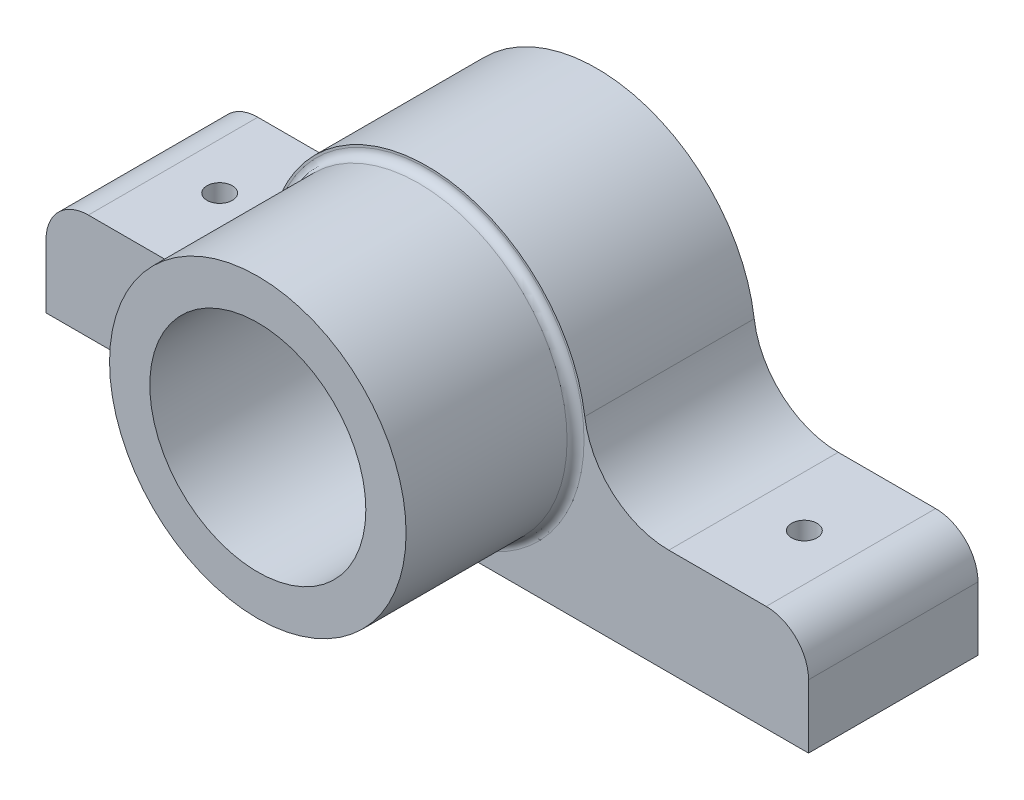
ISO-10303-21;
HEADER;
FILE_DESCRIPTION(('STEP AP214'),'2;1');
FILE_NAME('part.step','',(''),(''),'','','');
FILE_SCHEMA(('AUTOMOTIVE_DESIGN { 1 0 10303 214 1 1 1 1 }'));
ENDSEC;
DATA;
#1=APPLICATION_CONTEXT('core data for automotive mechanical design processes');
#2=APPLICATION_PROTOCOL_DEFINITION('international standard','automotive_design',2000,#1);
#3=PRODUCT_CONTEXT('',#1,'mechanical');
#4=PRODUCT('Part','Part','',(#3));
#5=PRODUCT_RELATED_PRODUCT_CATEGORY('part','',(#4));
#6=PRODUCT_DEFINITION_FORMATION('','',#4);
#7=PRODUCT_DEFINITION_CONTEXT('part definition',#1,'design');
#8=PRODUCT_DEFINITION('design','',#6,#7);
#9=PRODUCT_DEFINITION_SHAPE('','',#8);
#10=(LENGTH_UNIT() NAMED_UNIT(*) SI_UNIT(.MILLI.,.METRE.));
#11=(NAMED_UNIT(*) PLANE_ANGLE_UNIT() SI_UNIT($,.RADIAN.));
#12=(NAMED_UNIT(*) SI_UNIT($,.STERADIAN.) SOLID_ANGLE_UNIT());
#13=UNCERTAINTY_MEASURE_WITH_UNIT(LENGTH_MEASURE(1.E-05),#10,'distance_accuracy_value','');
#14=(GEOMETRIC_REPRESENTATION_CONTEXT(3) GLOBAL_UNCERTAINTY_ASSIGNED_CONTEXT((#13)) GLOBAL_UNIT_ASSIGNED_CONTEXT((#10,
#11,#12)) REPRESENTATION_CONTEXT('',''));
#15=CARTESIAN_POINT('',(0.,0.,0.));
#16=DIRECTION('',(0.,0.,1.));
#17=DIRECTION('',(1.,0.,0.));
#18=AXIS2_PLACEMENT_3D('',#15,#16,#17);
#19=CARTESIAN_POINT('',(6.35,4.7625,5.08));
#20=DIRECTION('',(0.,0.,-1.));
#21=DIRECTION('',(-1.,0.,0.));
#22=AXIS2_PLACEMENT_3D('',#19,#20,#21);
#23=CYLINDRICAL_SURFACE('',#22,0.635000000000001);
#24=CARTESIAN_POINT('',(6.35,4.7625,0.));
#25=DIRECTION('',(0.,0.,1.));
#26=DIRECTION('',(1.,0.,0.));
#27=AXIS2_PLACEMENT_3D('',#24,#25,#26);
#28=CIRCLE('',#27,0.635000000000001);
#29=CARTESIAN_POINT('',(6.985,4.7625,0.));
#30=VERTEX_POINT('',#29);
#31=EDGE_CURVE('E125',#30,#30,#28,.T.);
#32=ORIENTED_EDGE('',*,*,#31,.F.);
#33=EDGE_LOOP('',(#32));
#34=FACE_BOUND('',#33,.T.);
#35=CARTESIAN_POINT('',(6.35,4.7625,3.81));
#36=DIRECTION('',(0.,0.,1.));
#37=DIRECTION('',(1.,0.,0.));
#38=AXIS2_PLACEMENT_3D('',#35,#36,#37);
#39=CIRCLE('',#38,0.635000000000001);
#40=CARTESIAN_POINT('',(6.985,4.7625,3.81));
#41=VERTEX_POINT('',#40);
#42=EDGE_CURVE('E146',#41,#41,#39,.T.);
#43=ORIENTED_EDGE('',*,*,#42,.T.);
#44=EDGE_LOOP('',(#43));
#45=FACE_BOUND('',#44,.T.);
#46=ADVANCED_FACE('F32',(#34,#45),#23,.F.);
#47=CARTESIAN_POINT('',(70.29958,4.7625,5.08));
#48=DIRECTION('',(0.,0.,1.));
#49=DIRECTION('',(1.,0.,0.));
#50=AXIS2_PLACEMENT_3D('',#47,#48,#49);
#51=PLANE('',#50);
#52=DIRECTION('',(0.,-1.,0.));
#53=VECTOR('',#52,1.);
#54=CARTESIAN_POINT('',(17.78,4.76250000000001,5.08));
#55=LINE('',#54,#53);
#56=CARTESIAN_POINT('',(17.78,1.905,5.08));
#57=VERTEX_POINT('',#56);
#58=CARTESIAN_POINT('',(17.78,0.,5.08));
#59=VERTEX_POINT('',#58);
#60=EDGE_CURVE('E109',#57,#59,#55,.T.);
#61=ORIENTED_EDGE('',*,*,#60,.F.);
#62=CARTESIAN_POINT('',(16.51,1.905,5.08));
#63=DIRECTION('',(0.,0.,1.));
#64=DIRECTION('',(1.,0.,0.));
#65=AXIS2_PLACEMENT_3D('',#62,#63,#64);
#66=CIRCLE('',#65,1.27);
#67=CARTESIAN_POINT('',(16.51,3.175,5.08));
#68=VERTEX_POINT('',#67);
#69=EDGE_CURVE('E11',#57,#68,#66,.T.);
#70=ORIENTED_EDGE('',*,*,#69,.T.);
#71=DIRECTION('',(-1.,0.,0.));
#72=VECTOR('',#71,1.);
#73=CARTESIAN_POINT('',(11.1125,3.175,5.08));
#74=LINE('',#73,#72);
#75=CARTESIAN_POINT('',(13.5901139493795,3.175,5.08));
#76=VERTEX_POINT('',#75);
#77=EDGE_CURVE('E191',#68,#76,#74,.T.);
#78=ORIENTED_EDGE('',*,*,#77,.T.);
#79=CARTESIAN_POINT('',(13.5901139493795,5.715,5.08));
#80=DIRECTION('',(0.,0.,1.));
#81=DIRECTION('',(1.,0.,0.));
#82=AXIS2_PLACEMENT_3D('',#79,#80,#81);
#83=CIRCLE('',#82,2.54);
#84=CARTESIAN_POINT('',(11.0718134452475,5.38369565217391,5.08));
#85=VERTEX_POINT('',#84);
#86=EDGE_CURVE('E169',#76,#85,#83,.F.);
#87=ORIENTED_EDGE('',*,*,#86,.T.);
#88=CARTESIAN_POINT('',(6.35,4.7625,5.08));
#89=DIRECTION('',(0.,0.,1.));
#90=DIRECTION('',(-1.,0.,0.));
#91=AXIS2_PLACEMENT_3D('',#88,#89,#90);
#92=CIRCLE('',#91,4.7625);
#93=CARTESIAN_POINT('',(1.62818655475248,5.38369565217391,5.08));
#94=VERTEX_POINT('',#93);
#95=EDGE_CURVE('E205',#85,#94,#92,.T.);
#96=ORIENTED_EDGE('',*,*,#95,.T.);
#97=CARTESIAN_POINT('',(-0.890113949379528,5.715,5.08));
#98=DIRECTION('',(0.,0.,1.));
#99=DIRECTION('',(1.,0.,0.));
#100=AXIS2_PLACEMENT_3D('',#97,#98,#99);
#101=CIRCLE('',#100,2.54);
#102=CARTESIAN_POINT('',(-0.890113949379527,3.175,5.08));
#103=VERTEX_POINT('',#102);
#104=EDGE_CURVE('E173',#94,#103,#101,.F.);
#105=ORIENTED_EDGE('',*,*,#104,.T.);
#106=DIRECTION('',(-1.,0.,0.));
#107=VECTOR('',#106,1.);
#108=CARTESIAN_POINT('',(0.,3.175,5.08));
#109=LINE('',#108,#107);
#110=CARTESIAN_POINT('',(-3.81,3.175,5.08));
#111=VERTEX_POINT('',#110);
#112=EDGE_CURVE('E210',#103,#111,#109,.T.);
#113=ORIENTED_EDGE('',*,*,#112,.T.);
#114=CARTESIAN_POINT('',(-3.81,1.905,5.08));
#115=DIRECTION('',(0.,0.,1.));
#116=DIRECTION('',(1.,0.,0.));
#117=AXIS2_PLACEMENT_3D('',#114,#115,#116);
#118=CIRCLE('',#117,1.27);
#119=CARTESIAN_POINT('',(-5.08,1.905,5.08));
#120=VERTEX_POINT('',#119);
#121=EDGE_CURVE('E177',#111,#120,#118,.T.);
#122=ORIENTED_EDGE('',*,*,#121,.T.);
#123=DIRECTION('',(0.,-1.,0.));
#124=VECTOR('',#123,1.);
#125=CARTESIAN_POINT('',(-5.08,3.175,5.08));
#126=LINE('',#125,#124);
#127=CARTESIAN_POINT('',(-5.08,0.,5.08));
#128=VERTEX_POINT('',#127);
#129=EDGE_CURVE('E133',#120,#128,#126,.T.);
#130=ORIENTED_EDGE('',*,*,#129,.T.);
#131=DIRECTION('',(1.,0.,0.));
#132=VECTOR('',#131,1.);
#133=CARTESIAN_POINT('',(-5.08,0.,5.08));
#134=LINE('',#133,#132);
#135=EDGE_CURVE('E143',#128,#59,#134,.T.);
#136=ORIENTED_EDGE('',*,*,#135,.T.);
#137=EDGE_LOOP('',(#61,#70,#78,#87,#96,#105,#113,#122,#130,#136));
#138=FACE_BOUND('',#137,.T.);
#139=CARTESIAN_POINT('',(6.35,4.7625,5.08));
#140=DIRECTION('',(0.,0.,1.));
#141=DIRECTION('',(1.,0.,0.));
#142=AXIS2_PLACEMENT_3D('',#139,#140,#141);
#143=CIRCLE('',#142,4.699);
#144=CARTESIAN_POINT('',(11.049,4.7625,5.08));
#145=VERTEX_POINT('',#144);
#146=EDGE_CURVE('E145',#145,#145,#143,.F.);
#147=ORIENTED_EDGE('',*,*,#146,.T.);
#148=EDGE_LOOP('',(#147));
#149=FACE_BOUND('',#148,.T.);
#150=ADVANCED_FACE('F203',(#138,#149),#51,.T.);
#151=CARTESIAN_POINT('',(70.29958,4.7625,0.));
#152=DIRECTION('',(0.,0.,1.));
#153=DIRECTION('',(1.,0.,0.));
#154=AXIS2_PLACEMENT_3D('',#151,#152,#153);
#155=PLANE('',#154);
#156=ORIENTED_EDGE('',*,*,#31,.T.);
#157=EDGE_LOOP('',(#156));
#158=FACE_BOUND('',#157,.T.);
#159=DIRECTION('',(-1.,0.,0.));
#160=VECTOR('',#159,1.);
#161=CARTESIAN_POINT('',(11.1125,3.175,0.));
#162=LINE('',#161,#160);
#163=CARTESIAN_POINT('',(16.51,3.175,0.));
#164=VERTEX_POINT('',#163);
#165=CARTESIAN_POINT('',(13.5901139493795,3.175,0.));
#166=VERTEX_POINT('',#165);
#167=EDGE_CURVE('E124',#164,#166,#162,.T.);
#168=ORIENTED_EDGE('',*,*,#167,.F.);
#169=CARTESIAN_POINT('',(16.51,1.905,0.));
#170=DIRECTION('',(0.,0.,1.));
#171=DIRECTION('',(1.,0.,0.));
#172=AXIS2_PLACEMENT_3D('',#169,#170,#171);
#173=CIRCLE('',#172,1.27);
#174=CARTESIAN_POINT('',(17.78,1.905,0.));
#175=VERTEX_POINT('',#174);
#176=EDGE_CURVE('E54',#164,#175,#173,.F.);
#177=ORIENTED_EDGE('',*,*,#176,.T.);
#178=DIRECTION('',(0.,1.,0.));
#179=VECTOR('',#178,1.);
#180=CARTESIAN_POINT('',(17.78,0.,0.));
#181=LINE('',#180,#179);
#182=CARTESIAN_POINT('',(17.78,0.,0.));
#183=VERTEX_POINT('',#182);
#184=EDGE_CURVE('E108',#183,#175,#181,.T.);
#185=ORIENTED_EDGE('',*,*,#184,.F.);
#186=DIRECTION('',(1.,0.,0.));
#187=VECTOR('',#186,1.);
#188=CARTESIAN_POINT('',(81.72958,0.,0.));
#189=LINE('',#188,#187);
#190=CARTESIAN_POINT('',(-5.08,0.,0.));
#191=VERTEX_POINT('',#190);
#192=EDGE_CURVE('E118',#191,#183,#189,.T.);
#193=ORIENTED_EDGE('',*,*,#192,.F.);
#194=DIRECTION('',(0.,-1.,0.));
#195=VECTOR('',#194,1.);
#196=CARTESIAN_POINT('',(-5.08,3.175,0.));
#197=LINE('',#196,#195);
#198=CARTESIAN_POINT('',(-5.08,1.905,0.));
#199=VERTEX_POINT('',#198);
#200=EDGE_CURVE('E141',#199,#191,#197,.T.);
#201=ORIENTED_EDGE('',*,*,#200,.F.);
#202=CARTESIAN_POINT('',(-3.81,1.905,0.));
#203=DIRECTION('',(0.,0.,1.));
#204=DIRECTION('',(1.,0.,0.));
#205=AXIS2_PLACEMENT_3D('',#202,#203,#204);
#206=CIRCLE('',#205,1.27);
#207=CARTESIAN_POINT('',(-3.81,3.175,0.));
#208=VERTEX_POINT('',#207);
#209=EDGE_CURVE('E175',#199,#208,#206,.F.);
#210=ORIENTED_EDGE('',*,*,#209,.T.);
#211=DIRECTION('',(-1.,0.,0.));
#212=VECTOR('',#211,1.);
#213=CARTESIAN_POINT('',(0.,3.175,0.));
#214=LINE('',#213,#212);
#215=CARTESIAN_POINT('',(-0.890113949379527,3.175,0.));
#216=VERTEX_POINT('',#215);
#217=EDGE_CURVE('E138',#216,#208,#214,.T.);
#218=ORIENTED_EDGE('',*,*,#217,.F.);
#219=CARTESIAN_POINT('',(-0.890113949379528,5.715,0.));
#220=DIRECTION('',(0.,0.,1.));
#221=DIRECTION('',(1.,0.,0.));
#222=AXIS2_PLACEMENT_3D('',#219,#220,#221);
#223=CIRCLE('',#222,2.54);
#224=CARTESIAN_POINT('',(1.62818655475248,5.38369565217391,0.));
#225=VERTEX_POINT('',#224);
#226=EDGE_CURVE('E171',#216,#225,#223,.T.);
#227=ORIENTED_EDGE('',*,*,#226,.T.);
#228=CARTESIAN_POINT('',(6.35,4.7625,0.));
#229=DIRECTION('',(0.,0.,1.));
#230=DIRECTION('',(-1.,0.,0.));
#231=AXIS2_PLACEMENT_3D('',#228,#229,#230);
#232=CIRCLE('',#231,4.7625);
#233=CARTESIAN_POINT('',(11.0718134452475,5.38369565217391,0.));
#234=VERTEX_POINT('',#233);
#235=EDGE_CURVE('E127',#234,#225,#232,.T.);
#236=ORIENTED_EDGE('',*,*,#235,.F.);
#237=CARTESIAN_POINT('',(13.5901139493795,5.715,0.));
#238=DIRECTION('',(0.,0.,1.));
#239=DIRECTION('',(1.,0.,0.));
#240=AXIS2_PLACEMENT_3D('',#237,#238,#239);
#241=CIRCLE('',#240,2.54);
#242=EDGE_CURVE('E166',#234,#166,#241,.T.);
#243=ORIENTED_EDGE('',*,*,#242,.T.);
#244=EDGE_LOOP('',(#168,#177,#185,#193,#201,#210,#218,#227,#236,#243));
#245=FACE_BOUND('',#244,.T.);
#246=ADVANCED_FACE('F116',(#158,#245),#155,.F.);
#247=CARTESIAN_POINT('',(81.72958,0.,5.08));
#248=DIRECTION('',(0.,1.,0.));
#249=DIRECTION('',(-1.,0.,0.));
#250=AXIS2_PLACEMENT_3D('',#247,#248,#249);
#251=PLANE('',#250);
#252=CARTESIAN_POINT('',(15.113,0.,2.54));
#253=DIRECTION('',(0.,1.,0.));
#254=DIRECTION('',(-1.,0.,0.));
#255=AXIS2_PLACEMENT_3D('',#252,#253,#254);
#256=CIRCLE('',#255,0.381);
#257=CARTESIAN_POINT('',(14.732,0.,2.54));
#258=VERTEX_POINT('',#257);
#259=EDGE_CURVE('E227',#258,#258,#256,.T.);
#260=ORIENTED_EDGE('',*,*,#259,.T.);
#261=EDGE_LOOP('',(#260));
#262=FACE_BOUND('',#261,.T.);
#263=CARTESIAN_POINT('',(-2.413,0.,2.54));
#264=DIRECTION('',(0.,1.,0.));
#265=DIRECTION('',(-1.,0.,0.));
#266=AXIS2_PLACEMENT_3D('',#263,#264,#265);
#267=CIRCLE('',#266,0.381);
#268=CARTESIAN_POINT('',(-2.794,0.,2.54));
#269=VERTEX_POINT('',#268);
#270=EDGE_CURVE('E221',#269,#269,#267,.T.);
#271=ORIENTED_EDGE('',*,*,#270,.T.);
#272=EDGE_LOOP('',(#271));
#273=FACE_BOUND('',#272,.T.);
#274=ORIENTED_EDGE('',*,*,#192,.T.);
#275=DIRECTION('',(0.,0.,1.));
#276=VECTOR('',#275,1.);
#277=CARTESIAN_POINT('',(17.78,0.,0.));
#278=LINE('',#277,#276);
#279=EDGE_CURVE('E106',#183,#59,#278,.T.);
#280=ORIENTED_EDGE('',*,*,#279,.T.);
#281=ORIENTED_EDGE('',*,*,#135,.F.);
#282=DIRECTION('',(0.,0.,-1.));
#283=VECTOR('',#282,1.);
#284=CARTESIAN_POINT('',(-5.08,0.,5.08));
#285=LINE('',#284,#283);
#286=EDGE_CURVE('E123',#128,#191,#285,.T.);
#287=ORIENTED_EDGE('',*,*,#286,.T.);
#288=EDGE_LOOP('',(#274,#280,#281,#287));
#289=FACE_BOUND('',#288,.T.);
#290=ADVANCED_FACE('F121',(#262,#273,#289),#251,.F.);
#291=CARTESIAN_POINT('',(11.1125,3.175,5.08));
#292=DIRECTION('',(0.,-1.,0.));
#293=DIRECTION('',(1.,0.,0.));
#294=AXIS2_PLACEMENT_3D('',#291,#292,#293);
#295=PLANE('',#294);
#296=CARTESIAN_POINT('',(15.113,3.175,2.54));
#297=DIRECTION('',(0.,1.,0.));
#298=DIRECTION('',(-1.,0.,0.));
#299=AXIS2_PLACEMENT_3D('',#296,#297,#298);
#300=CIRCLE('',#299,0.381);
#301=CARTESIAN_POINT('',(14.732,3.175,2.54));
#302=VERTEX_POINT('',#301);
#303=EDGE_CURVE('E230',#302,#302,#300,.T.);
#304=ORIENTED_EDGE('',*,*,#303,.F.);
#305=EDGE_LOOP('',(#304));
#306=FACE_BOUND('',#305,.T.);
#307=ORIENTED_EDGE('',*,*,#77,.F.);
#308=DIRECTION('',(0.,0.,-1.));
#309=VECTOR('',#308,1.);
#310=CARTESIAN_POINT('',(16.51,3.175,5.08));
#311=LINE('',#310,#309);
#312=EDGE_CURVE('E184',#68,#164,#311,.T.);
#313=ORIENTED_EDGE('',*,*,#312,.T.);
#314=ORIENTED_EDGE('',*,*,#167,.T.);
#315=DIRECTION('',(0.,0.,1.));
#316=VECTOR('',#315,1.);
#317=CARTESIAN_POINT('',(13.5901139493795,3.175,5.08));
#318=LINE('',#317,#316);
#319=EDGE_CURVE('E160',#166,#76,#318,.T.);
#320=ORIENTED_EDGE('',*,*,#319,.T.);
#321=EDGE_LOOP('',(#307,#313,#314,#320));
#322=FACE_BOUND('',#321,.T.);
#323=ADVANCED_FACE('F190',(#306,#322),#295,.F.);
#324=CARTESIAN_POINT('',(6.35,4.7625,5.08));
#325=DIRECTION('',(0.,0.,-1.));
#326=DIRECTION('',(-1.,0.,0.));
#327=AXIS2_PLACEMENT_3D('',#324,#325,#326);
#328=CYLINDRICAL_SURFACE('',#327,4.7625);
#329=ORIENTED_EDGE('',*,*,#95,.F.);
#330=DIRECTION('',(0.,0.,-1.));
#331=VECTOR('',#330,1.);
#332=CARTESIAN_POINT('',(11.0718134452475,5.38369565217391,5.08));
#333=LINE('',#332,#331);
#334=EDGE_CURVE('E157',#85,#234,#333,.T.);
#335=ORIENTED_EDGE('',*,*,#334,.T.);
#336=ORIENTED_EDGE('',*,*,#235,.T.);
#337=DIRECTION('',(0.,0.,-1.));
#338=VECTOR('',#337,1.);
#339=CARTESIAN_POINT('',(1.62818655475248,5.38369565217391,5.08));
#340=LINE('',#339,#338);
#341=EDGE_CURVE('E155',#225,#94,#340,.F.);
#342=ORIENTED_EDGE('',*,*,#341,.T.);
#343=EDGE_LOOP('',(#329,#335,#336,#342));
#344=FACE_BOUND('',#343,.T.);
#345=ADVANCED_FACE('F208',(#344),#328,.T.);
#346=CARTESIAN_POINT('',(0.,3.175,5.08));
#347=DIRECTION('',(0.,-1.,0.));
#348=DIRECTION('',(1.,0.,0.));
#349=AXIS2_PLACEMENT_3D('',#346,#347,#348);
#350=PLANE('',#349);
#351=CARTESIAN_POINT('',(-2.413,3.175,2.54));
#352=DIRECTION('',(0.,1.,0.));
#353=DIRECTION('',(-1.,0.,0.));
#354=AXIS2_PLACEMENT_3D('',#351,#352,#353);
#355=CIRCLE('',#354,0.381);
#356=CARTESIAN_POINT('',(-2.794,3.175,2.54));
#357=VERTEX_POINT('',#356);
#358=EDGE_CURVE('E224',#357,#357,#355,.T.);
#359=ORIENTED_EDGE('',*,*,#358,.F.);
#360=EDGE_LOOP('',(#359));
#361=FACE_BOUND('',#360,.T.);
#362=ORIENTED_EDGE('',*,*,#217,.T.);
#363=DIRECTION('',(0.,0.,-1.));
#364=VECTOR('',#363,1.);
#365=CARTESIAN_POINT('',(-3.81,3.175,5.08));
#366=LINE('',#365,#364);
#367=EDGE_CURVE('E182',#208,#111,#366,.F.);
#368=ORIENTED_EDGE('',*,*,#367,.T.);
#369=ORIENTED_EDGE('',*,*,#112,.F.);
#370=DIRECTION('',(0.,0.,1.));
#371=VECTOR('',#370,1.);
#372=CARTESIAN_POINT('',(-0.890113949379527,3.175,0.));
#373=LINE('',#372,#371);
#374=EDGE_CURVE('E163',#103,#216,#373,.F.);
#375=ORIENTED_EDGE('',*,*,#374,.T.);
#376=EDGE_LOOP('',(#362,#368,#369,#375));
#377=FACE_BOUND('',#376,.T.);
#378=ADVANCED_FACE('F252',(#361,#377),#350,.F.);
#379=CARTESIAN_POINT('',(-5.08,3.175,5.08));
#380=DIRECTION('',(1.,0.,0.));
#381=DIRECTION('',(0.,1.,0.));
#382=AXIS2_PLACEMENT_3D('',#379,#380,#381);
#383=PLANE('',#382);
#384=ORIENTED_EDGE('',*,*,#129,.F.);
#385=DIRECTION('',(0.,0.,-1.));
#386=VECTOR('',#385,1.);
#387=CARTESIAN_POINT('',(-5.08,1.905,5.08));
#388=LINE('',#387,#386);
#389=EDGE_CURVE('E179',#120,#199,#388,.T.);
#390=ORIENTED_EDGE('',*,*,#389,.T.);
#391=ORIENTED_EDGE('',*,*,#200,.T.);
#392=ORIENTED_EDGE('',*,*,#286,.F.);
#393=EDGE_LOOP('',(#384,#390,#391,#392));
#394=FACE_BOUND('',#393,.T.);
#395=ADVANCED_FACE('F271',(#394),#383,.F.);
#396=CARTESIAN_POINT('',(6.35,4.7625,10.16));
#397=DIRECTION('',(0.,0.,1.));
#398=DIRECTION('',(1.,0.,0.));
#399=AXIS2_PLACEMENT_3D('',#396,#397,#398);
#400=PLANE('',#399);
#401=CARTESIAN_POINT('',(6.35,4.7625,10.16));
#402=DIRECTION('',(0.,0.,1.));
#403=DIRECTION('',(1.,0.,0.));
#404=AXIS2_PLACEMENT_3D('',#401,#402,#403);
#405=CIRCLE('',#404,3.2385);
#406=CARTESIAN_POINT('',(9.5885,4.7625,10.16));
#407=VERTEX_POINT('',#406);
#408=EDGE_CURVE('E218',#407,#407,#405,.T.);
#409=ORIENTED_EDGE('',*,*,#408,.F.);
#410=EDGE_LOOP('',(#409));
#411=FACE_BOUND('',#410,.T.);
#412=CARTESIAN_POINT('',(6.35,4.7625,10.16));
#413=DIRECTION('',(0.,0.,1.));
#414=DIRECTION('',(1.,0.,0.));
#415=AXIS2_PLACEMENT_3D('',#412,#413,#414);
#416=CIRCLE('',#415,4.445);
#417=CARTESIAN_POINT('',(10.795,4.7625,10.16));
#418=VERTEX_POINT('',#417);
#419=EDGE_CURVE('E130',#418,#418,#416,.T.);
#420=ORIENTED_EDGE('',*,*,#419,.T.);
#421=EDGE_LOOP('',(#420));
#422=FACE_BOUND('',#421,.T.);
#423=ADVANCED_FACE('F274',(#411,#422),#400,.T.);
#424=CARTESIAN_POINT('',(6.35,4.7625,10.16));
#425=DIRECTION('',(0.,0.,-1.));
#426=DIRECTION('',(-1.,0.,0.));
#427=AXIS2_PLACEMENT_3D('',#424,#425,#426);
#428=CYLINDRICAL_SURFACE('',#427,4.445);
#429=CARTESIAN_POINT('',(6.35,4.7625,5.334));
#430=DIRECTION('',(0.,0.,1.));
#431=DIRECTION('',(1.,0.,0.));
#432=AXIS2_PLACEMENT_3D('',#429,#430,#431);
#433=CIRCLE('',#432,4.445);
#434=CARTESIAN_POINT('',(10.795,4.7625,5.334));
#435=VERTEX_POINT('',#434);
#436=EDGE_CURVE('E152',#435,#435,#433,.T.);
#437=ORIENTED_EDGE('',*,*,#436,.T.);
#438=EDGE_LOOP('',(#437));
#439=FACE_BOUND('',#438,.T.);
#440=ORIENTED_EDGE('',*,*,#419,.F.);
#441=EDGE_LOOP('',(#440));
#442=FACE_BOUND('',#441,.T.);
#443=ADVANCED_FACE('F265',(#439,#442),#428,.T.);
#444=CARTESIAN_POINT('',(6.35,4.7625,3.81));
#445=DIRECTION('',(0.,0.,1.));
#446=DIRECTION('',(1.,0.,0.));
#447=AXIS2_PLACEMENT_3D('',#444,#445,#446);
#448=CYLINDRICAL_SURFACE('',#447,3.2385);
#449=CARTESIAN_POINT('',(6.35,4.7625,3.81));
#450=DIRECTION('',(0.,0.,1.));
#451=DIRECTION('',(1.,0.,0.));
#452=AXIS2_PLACEMENT_3D('',#449,#450,#451);
#453=CIRCLE('',#452,3.2385);
#454=CARTESIAN_POINT('',(9.5885,4.7625,3.81));
#455=VERTEX_POINT('',#454);
#456=EDGE_CURVE('E149',#455,#455,#453,.T.);
#457=ORIENTED_EDGE('',*,*,#456,.F.);
#458=EDGE_LOOP('',(#457));
#459=FACE_BOUND('',#458,.T.);
#460=ORIENTED_EDGE('',*,*,#408,.T.);
#461=EDGE_LOOP('',(#460));
#462=FACE_BOUND('',#461,.T.);
#463=ADVANCED_FACE('F306',(#459,#462),#448,.F.);
#464=CARTESIAN_POINT('',(6.35,4.7625,3.81));
#465=DIRECTION('',(0.,0.,1.));
#466=DIRECTION('',(1.,0.,0.));
#467=AXIS2_PLACEMENT_3D('',#464,#465,#466);
#468=PLANE('',#467);
#469=ORIENTED_EDGE('',*,*,#42,.F.);
#470=EDGE_LOOP('',(#469));
#471=FACE_BOUND('',#470,.T.);
#472=ORIENTED_EDGE('',*,*,#456,.T.);
#473=EDGE_LOOP('',(#472));
#474=FACE_BOUND('',#473,.T.);
#475=ADVANCED_FACE('F302',(#471,#474),#468,.T.);
#476=CARTESIAN_POINT('',(6.35,4.7625,5.334));
#477=DIRECTION('',(0.,0.,1.));
#478=DIRECTION('',(1.,0.,0.));
#479=AXIS2_PLACEMENT_3D('',#476,#477,#478);
#480=TOROIDAL_SURFACE('',#479,4.699,0.254);
#481=ORIENTED_EDGE('',*,*,#146,.F.);
#482=EDGE_LOOP('',(#481));
#483=FACE_BOUND('',#482,.T.);
#484=ORIENTED_EDGE('',*,*,#436,.F.);
#485=EDGE_LOOP('',(#484));
#486=FACE_BOUND('',#485,.T.);
#487=ADVANCED_FACE('F305',(#483,#486),#480,.F.);
#488=CARTESIAN_POINT('',(13.5901139493795,5.715,5.08));
#489=DIRECTION('',(0.,0.,-1.));
#490=DIRECTION('',(-1.,0.,0.));
#491=AXIS2_PLACEMENT_3D('',#488,#489,#490);
#492=CYLINDRICAL_SURFACE('',#491,2.54);
#493=ORIENTED_EDGE('',*,*,#86,.F.);
#494=ORIENTED_EDGE('',*,*,#319,.F.);
#495=ORIENTED_EDGE('',*,*,#242,.F.);
#496=ORIENTED_EDGE('',*,*,#334,.F.);
#497=EDGE_LOOP('',(#493,#494,#495,#496));
#498=FACE_BOUND('',#497,.T.);
#499=ADVANCED_FACE('F199',(#498),#492,.F.);
#500=CARTESIAN_POINT('',(-0.890113949379528,5.715,5.08));
#501=DIRECTION('',(0.,0.,-1.));
#502=DIRECTION('',(-1.,0.,0.));
#503=AXIS2_PLACEMENT_3D('',#500,#501,#502);
#504=CYLINDRICAL_SURFACE('',#503,2.54);
#505=ORIENTED_EDGE('',*,*,#104,.F.);
#506=ORIENTED_EDGE('',*,*,#341,.F.);
#507=ORIENTED_EDGE('',*,*,#226,.F.);
#508=ORIENTED_EDGE('',*,*,#374,.F.);
#509=EDGE_LOOP('',(#505,#506,#507,#508));
#510=FACE_BOUND('',#509,.T.);
#511=ADVANCED_FACE('F331',(#510),#504,.F.);
#512=CARTESIAN_POINT('',(-3.81,1.905,5.08));
#513=DIRECTION('',(0.,0.,-1.));
#514=DIRECTION('',(-1.,0.,0.));
#515=AXIS2_PLACEMENT_3D('',#512,#513,#514);
#516=CYLINDRICAL_SURFACE('',#515,1.27);
#517=ORIENTED_EDGE('',*,*,#121,.F.);
#518=ORIENTED_EDGE('',*,*,#367,.F.);
#519=ORIENTED_EDGE('',*,*,#209,.F.);
#520=ORIENTED_EDGE('',*,*,#389,.F.);
#521=EDGE_LOOP('',(#517,#518,#519,#520));
#522=FACE_BOUND('',#521,.T.);
#523=ADVANCED_FACE('F288',(#522),#516,.T.);
#524=CARTESIAN_POINT('',(-2.413,0.,2.54));
#525=DIRECTION('',(0.,1.,0.));
#526=DIRECTION('',(-1.,0.,0.));
#527=AXIS2_PLACEMENT_3D('',#524,#525,#526);
#528=CYLINDRICAL_SURFACE('',#527,0.381);
#529=ORIENTED_EDGE('',*,*,#270,.F.);
#530=EDGE_LOOP('',(#529));
#531=FACE_BOUND('',#530,.T.);
#532=ORIENTED_EDGE('',*,*,#358,.T.);
#533=EDGE_LOOP('',(#532));
#534=FACE_BOUND('',#533,.T.);
#535=ADVANCED_FACE('F242',(#531,#534),#528,.F.);
#536=CARTESIAN_POINT('',(15.113,0.,2.54));
#537=DIRECTION('',(0.,1.,0.));
#538=DIRECTION('',(-1.,0.,0.));
#539=AXIS2_PLACEMENT_3D('',#536,#537,#538);
#540=CYLINDRICAL_SURFACE('',#539,0.381);
#541=ORIENTED_EDGE('',*,*,#259,.F.);
#542=EDGE_LOOP('',(#541));
#543=FACE_BOUND('',#542,.T.);
#544=ORIENTED_EDGE('',*,*,#303,.T.);
#545=EDGE_LOOP('',(#544));
#546=FACE_BOUND('',#545,.T.);
#547=ADVANCED_FACE('F239',(#543,#546),#540,.F.);
#548=CARTESIAN_POINT('',(17.78,0.,0.));
#549=DIRECTION('',(-1.,0.,0.));
#550=DIRECTION('',(0.,-1.,0.));
#551=AXIS2_PLACEMENT_3D('',#548,#549,#550);
#552=PLANE('',#551);
#553=ORIENTED_EDGE('',*,*,#184,.T.);
#554=DIRECTION('',(0.,0.,-1.));
#555=VECTOR('',#554,1.);
#556=CARTESIAN_POINT('',(17.78,1.905,0.));
#557=LINE('',#556,#555);
#558=EDGE_CURVE('E40',#175,#57,#557,.F.);
#559=ORIENTED_EDGE('',*,*,#558,.T.);
#560=ORIENTED_EDGE('',*,*,#60,.T.);
#561=ORIENTED_EDGE('',*,*,#279,.F.);
#562=EDGE_LOOP('',(#553,#559,#560,#561));
#563=FACE_BOUND('',#562,.T.);
#564=ADVANCED_FACE('F107',(#563),#552,.F.);
#565=CARTESIAN_POINT('',(16.51,1.905,5.08));
#566=DIRECTION('',(0.,0.,-1.));
#567=DIRECTION('',(-1.,0.,0.));
#568=AXIS2_PLACEMENT_3D('',#565,#566,#567);
#569=CYLINDRICAL_SURFACE('',#568,1.27);
#570=ORIENTED_EDGE('',*,*,#69,.F.);
#571=ORIENTED_EDGE('',*,*,#558,.F.);
#572=ORIENTED_EDGE('',*,*,#176,.F.);
#573=ORIENTED_EDGE('',*,*,#312,.F.);
#574=EDGE_LOOP('',(#570,#571,#572,#573));
#575=FACE_BOUND('',#574,.T.);
#576=ADVANCED_FACE('F34',(#575),#569,.T.);
#577=CLOSED_SHELL('',(#46,#150,#246,#290,#323,#345,#378,#395,#423,#443,#463,#475,#487,#499,#511,
#523,#535,#547,#564,#576));
#578=MANIFOLD_SOLID_BREP('B2',#577);
#579=ADVANCED_BREP_SHAPE_REPRESENTATION('',(#18,#578),#14);
#580=SHAPE_DEFINITION_REPRESENTATION(#9,#579);
ENDSEC;
END-ISO-10303-21;
